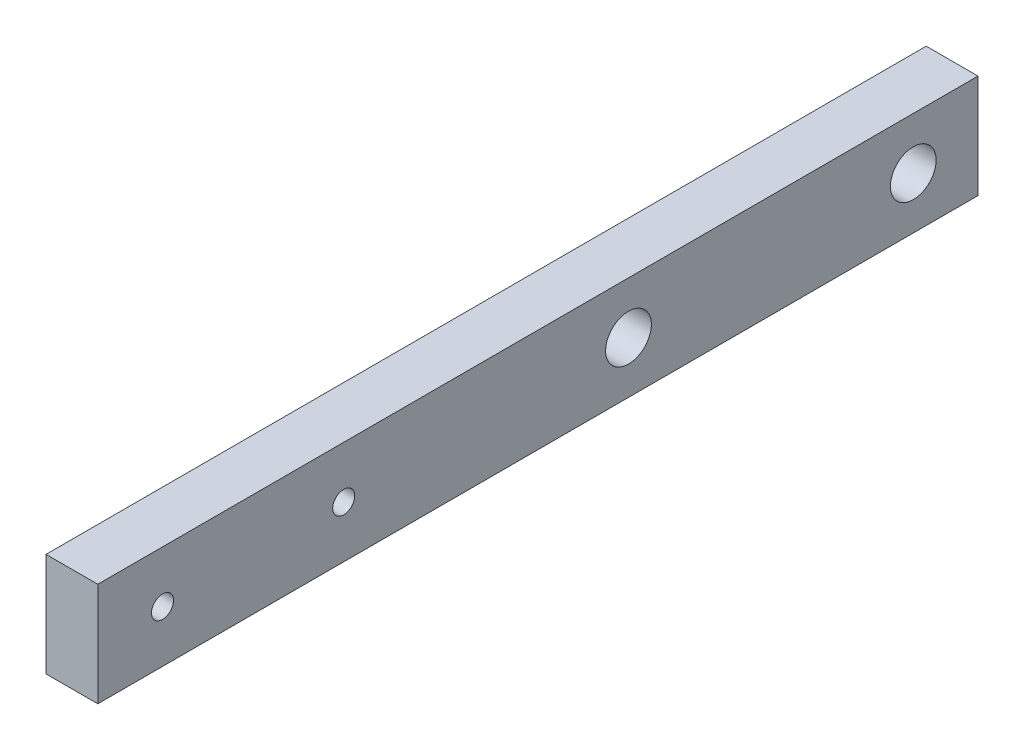
ISO-10303-21;
HEADER;
FILE_DESCRIPTION(('STEP AP214'),'2;1');
FILE_NAME('part.step','',(''),(''),'','','');
FILE_SCHEMA(('AUTOMOTIVE_DESIGN { 1 0 10303 214 1 1 1 1 }'));
ENDSEC;
DATA;
#1=APPLICATION_CONTEXT('core data for automotive mechanical design processes');
#2=APPLICATION_PROTOCOL_DEFINITION('international standard','automotive_design',2000,#1);
#3=PRODUCT_CONTEXT('',#1,'mechanical');
#4=PRODUCT('Part','Part','',(#3));
#5=PRODUCT_RELATED_PRODUCT_CATEGORY('part','',(#4));
#6=PRODUCT_DEFINITION_FORMATION('','',#4);
#7=PRODUCT_DEFINITION_CONTEXT('part definition',#1,'design');
#8=PRODUCT_DEFINITION('design','',#6,#7);
#9=PRODUCT_DEFINITION_SHAPE('','',#8);
#10=(LENGTH_UNIT() NAMED_UNIT(*) SI_UNIT(.MILLI.,.METRE.));
#11=(NAMED_UNIT(*) PLANE_ANGLE_UNIT() SI_UNIT($,.RADIAN.));
#12=(NAMED_UNIT(*) SI_UNIT($,.STERADIAN.) SOLID_ANGLE_UNIT());
#13=UNCERTAINTY_MEASURE_WITH_UNIT(LENGTH_MEASURE(1.E-05),#10,'distance_accuracy_value','');
#14=(GEOMETRIC_REPRESENTATION_CONTEXT(3) GLOBAL_UNCERTAINTY_ASSIGNED_CONTEXT((#13)) GLOBAL_UNIT_ASSIGNED_CONTEXT((#10,
#11,#12)) REPRESENTATION_CONTEXT('',''));
#15=CARTESIAN_POINT('',(0.,0.,0.));
#16=DIRECTION('',(0.,0.,1.));
#17=DIRECTION('',(1.,0.,0.));
#18=AXIS2_PLACEMENT_3D('',#15,#16,#17);
#19=CARTESIAN_POINT('',(0.,0.,107.95));
#20=DIRECTION('',(1.,0.,0.));
#21=DIRECTION('',(0.,0.,-1.));
#22=AXIS2_PLACEMENT_3D('',#19,#20,#21);
#23=PLANE('',#22);
#24=CARTESIAN_POINT('',(0.,6.35,100.0125));
#25=DIRECTION('',(-1.,0.,0.));
#26=DIRECTION('',(0.,0.,1.));
#27=AXIS2_PLACEMENT_3D('',#24,#25,#26);
#28=CIRCLE('',#27,1.35254999999999);
#29=CARTESIAN_POINT('',(0.,6.35,101.36505));
#30=VERTEX_POINT('',#29);
#31=EDGE_CURVE('E147',#30,#30,#28,.T.);
#32=ORIENTED_EDGE('',*,*,#31,.F.);
#33=EDGE_LOOP('',(#32));
#34=FACE_BOUND('',#33,.T.);
#35=CARTESIAN_POINT('',(0.,6.35,77.7875));
#36=DIRECTION('',(-1.,0.,0.));
#37=DIRECTION('',(0.,0.,1.));
#38=AXIS2_PLACEMENT_3D('',#35,#36,#37);
#39=CIRCLE('',#38,1.35254999999999);
#40=CARTESIAN_POINT('',(0.,6.35,79.14005));
#41=VERTEX_POINT('',#40);
#42=EDGE_CURVE('E151',#41,#41,#39,.T.);
#43=ORIENTED_EDGE('',*,*,#42,.F.);
#44=EDGE_LOOP('',(#43));
#45=FACE_BOUND('',#44,.T.);
#46=CARTESIAN_POINT('',(0.,6.35,42.8625));
#47=DIRECTION('',(1.,0.,0.));
#48=DIRECTION('',(0.,0.,-1.));
#49=AXIS2_PLACEMENT_3D('',#46,#47,#48);
#50=CIRCLE('',#49,2.8067);
#51=CARTESIAN_POINT('',(0.,6.35,40.0558));
#52=VERTEX_POINT('',#51);
#53=EDGE_CURVE('E155',#52,#52,#50,.T.);
#54=ORIENTED_EDGE('',*,*,#53,.T.);
#55=EDGE_LOOP('',(#54));
#56=FACE_BOUND('',#55,.T.);
#57=CARTESIAN_POINT('',(0.,6.35,7.93750000000001));
#58=DIRECTION('',(1.,0.,0.));
#59=DIRECTION('',(0.,0.,-1.));
#60=AXIS2_PLACEMENT_3D('',#57,#58,#59);
#61=CIRCLE('',#60,2.8067);
#62=CARTESIAN_POINT('',(0.,6.35,5.13080000000001));
#63=VERTEX_POINT('',#62);
#64=EDGE_CURVE('E107',#63,#63,#61,.T.);
#65=ORIENTED_EDGE('',*,*,#64,.T.);
#66=EDGE_LOOP('',(#65));
#67=FACE_BOUND('',#66,.T.);
#68=DIRECTION('',(0.,-1.,0.));
#69=VECTOR('',#68,1.);
#70=CARTESIAN_POINT('',(0.,0.,0.));
#71=LINE('',#70,#69);
#72=CARTESIAN_POINT('',(0.,12.7,0.));
#73=VERTEX_POINT('',#72);
#74=CARTESIAN_POINT('',(0.,0.,0.));
#75=VERTEX_POINT('',#74);
#76=EDGE_CURVE('E94',#73,#75,#71,.T.);
#77=ORIENTED_EDGE('',*,*,#76,.T.);
#78=DIRECTION('',(0.,0.,-1.));
#79=VECTOR('',#78,1.);
#80=CARTESIAN_POINT('',(0.,0.,107.95));
#81=LINE('',#80,#79);
#82=CARTESIAN_POINT('',(0.,0.,107.95));
#83=VERTEX_POINT('',#82);
#84=EDGE_CURVE('E13',#83,#75,#81,.T.);
#85=ORIENTED_EDGE('',*,*,#84,.F.);
#86=DIRECTION('',(0.,-1.,0.));
#87=VECTOR('',#86,1.);
#88=CARTESIAN_POINT('',(0.,0.,107.95));
#89=LINE('',#88,#87);
#90=CARTESIAN_POINT('',(0.,12.7,107.95));
#91=VERTEX_POINT('',#90);
#92=EDGE_CURVE('E117',#91,#83,#89,.T.);
#93=ORIENTED_EDGE('',*,*,#92,.F.);
#94=DIRECTION('',(0.,0.,-1.));
#95=VECTOR('',#94,1.);
#96=CARTESIAN_POINT('',(0.,12.7,107.95));
#97=LINE('',#96,#95);
#98=EDGE_CURVE('E106',#91,#73,#97,.T.);
#99=ORIENTED_EDGE('',*,*,#98,.T.);
#100=EDGE_LOOP('',(#77,#85,#93,#99));
#101=FACE_BOUND('',#100,.T.);
#102=ADVANCED_FACE('F50',(#34,#45,#56,#67,#101),#23,.F.);
#103=CARTESIAN_POINT('',(0.,0.,107.95));
#104=DIRECTION('',(0.,1.,0.));
#105=DIRECTION('',(0.,0.,1.));
#106=AXIS2_PLACEMENT_3D('',#103,#104,#105);
#107=PLANE('',#106);
#108=DIRECTION('',(1.,0.,0.));
#109=VECTOR('',#108,1.);
#110=CARTESIAN_POINT('',(0.,0.,0.));
#111=LINE('',#110,#109);
#112=CARTESIAN_POINT('',(6.35,0.,0.));
#113=VERTEX_POINT('',#112);
#114=EDGE_CURVE('E90',#75,#113,#111,.T.);
#115=ORIENTED_EDGE('',*,*,#114,.T.);
#116=DIRECTION('',(0.,0.,-1.));
#117=VECTOR('',#116,1.);
#118=CARTESIAN_POINT('',(6.35,0.,107.95));
#119=LINE('',#118,#117);
#120=CARTESIAN_POINT('',(6.35,0.,107.95));
#121=VERTEX_POINT('',#120);
#122=EDGE_CURVE('E57',#121,#113,#119,.T.);
#123=ORIENTED_EDGE('',*,*,#122,.F.);
#124=DIRECTION('',(1.,0.,0.));
#125=VECTOR('',#124,1.);
#126=CARTESIAN_POINT('',(0.,0.,107.95));
#127=LINE('',#126,#125);
#128=EDGE_CURVE('E102',#83,#121,#127,.T.);
#129=ORIENTED_EDGE('',*,*,#128,.F.);
#130=ORIENTED_EDGE('',*,*,#84,.T.);
#131=EDGE_LOOP('',(#115,#123,#129,#130));
#132=FACE_BOUND('',#131,.T.);
#133=ADVANCED_FACE('F101',(#132),#107,.F.);
#134=CARTESIAN_POINT('',(6.35,0.,107.95));
#135=DIRECTION('',(-1.,0.,0.));
#136=DIRECTION('',(0.,0.,1.));
#137=AXIS2_PLACEMENT_3D('',#134,#135,#136);
#138=PLANE('',#137);
#139=CARTESIAN_POINT('',(6.35,6.35,100.0125));
#140=DIRECTION('',(-1.,0.,0.));
#141=DIRECTION('',(0.,0.,1.));
#142=AXIS2_PLACEMENT_3D('',#139,#140,#141);
#143=CIRCLE('',#142,1.35255);
#144=CARTESIAN_POINT('',(6.35,6.35,101.36505));
#145=VERTEX_POINT('',#144);
#146=EDGE_CURVE('E175',#145,#145,#143,.T.);
#147=ORIENTED_EDGE('',*,*,#146,.T.);
#148=EDGE_LOOP('',(#147));
#149=FACE_BOUND('',#148,.T.);
#150=CARTESIAN_POINT('',(6.35,6.35,77.7875));
#151=DIRECTION('',(-1.,0.,0.));
#152=DIRECTION('',(0.,0.,1.));
#153=AXIS2_PLACEMENT_3D('',#150,#151,#152);
#154=CIRCLE('',#153,1.35255);
#155=CARTESIAN_POINT('',(6.35,6.35,79.14005));
#156=VERTEX_POINT('',#155);
#157=EDGE_CURVE('E171',#156,#156,#154,.T.);
#158=ORIENTED_EDGE('',*,*,#157,.T.);
#159=EDGE_LOOP('',(#158));
#160=FACE_BOUND('',#159,.T.);
#161=CARTESIAN_POINT('',(6.35,6.35,42.8625));
#162=DIRECTION('',(1.,0.,0.));
#163=DIRECTION('',(0.,0.,-1.));
#164=AXIS2_PLACEMENT_3D('',#161,#162,#163);
#165=CIRCLE('',#164,2.80669999999999);
#166=CARTESIAN_POINT('',(6.35,6.35,40.0558));
#167=VERTEX_POINT('',#166);
#168=EDGE_CURVE('E165',#167,#167,#165,.T.);
#169=ORIENTED_EDGE('',*,*,#168,.F.);
#170=EDGE_LOOP('',(#169));
#171=FACE_BOUND('',#170,.T.);
#172=CARTESIAN_POINT('',(6.35,6.35,7.93750000000001));
#173=DIRECTION('',(1.,0.,0.));
#174=DIRECTION('',(0.,0.,-1.));
#175=AXIS2_PLACEMENT_3D('',#172,#173,#174);
#176=CIRCLE('',#175,2.80669999999999);
#177=CARTESIAN_POINT('',(6.35,6.35,5.13080000000003));
#178=VERTEX_POINT('',#177);
#179=EDGE_CURVE('E110',#178,#178,#176,.T.);
#180=ORIENTED_EDGE('',*,*,#179,.F.);
#181=EDGE_LOOP('',(#180));
#182=FACE_BOUND('',#181,.T.);
#183=DIRECTION('',(0.,1.,0.));
#184=VECTOR('',#183,1.);
#185=CARTESIAN_POINT('',(6.35,0.,0.));
#186=LINE('',#185,#184);
#187=CARTESIAN_POINT('',(6.35,12.7,0.));
#188=VERTEX_POINT('',#187);
#189=EDGE_CURVE('E95',#113,#188,#186,.T.);
#190=ORIENTED_EDGE('',*,*,#189,.T.);
#191=DIRECTION('',(0.,0.,-1.));
#192=VECTOR('',#191,1.);
#193=CARTESIAN_POINT('',(6.35,12.7,107.95));
#194=LINE('',#193,#192);
#195=CARTESIAN_POINT('',(6.35,12.7,107.95));
#196=VERTEX_POINT('',#195);
#197=EDGE_CURVE('E123',#196,#188,#194,.T.);
#198=ORIENTED_EDGE('',*,*,#197,.F.);
#199=DIRECTION('',(0.,1.,0.));
#200=VECTOR('',#199,1.);
#201=CARTESIAN_POINT('',(6.35,0.,107.95));
#202=LINE('',#201,#200);
#203=EDGE_CURVE('E69',#121,#196,#202,.T.);
#204=ORIENTED_EDGE('',*,*,#203,.F.);
#205=ORIENTED_EDGE('',*,*,#122,.T.);
#206=EDGE_LOOP('',(#190,#198,#204,#205));
#207=FACE_BOUND('',#206,.T.);
#208=ADVANCED_FACE('F126',(#149,#160,#171,#182,#207),#138,.F.);
#209=CARTESIAN_POINT('',(0.,12.7,107.95));
#210=DIRECTION('',(0.,-1.,0.));
#211=DIRECTION('',(0.,0.,-1.));
#212=AXIS2_PLACEMENT_3D('',#209,#210,#211);
#213=PLANE('',#212);
#214=DIRECTION('',(-1.,0.,0.));
#215=VECTOR('',#214,1.);
#216=CARTESIAN_POINT('',(0.,12.7,0.));
#217=LINE('',#216,#215);
#218=EDGE_CURVE('E115',#188,#73,#217,.T.);
#219=ORIENTED_EDGE('',*,*,#218,.T.);
#220=ORIENTED_EDGE('',*,*,#98,.F.);
#221=DIRECTION('',(-1.,0.,0.));
#222=VECTOR('',#221,1.);
#223=CARTESIAN_POINT('',(0.,12.7,107.95));
#224=LINE('',#223,#222);
#225=EDGE_CURVE('E64',#196,#91,#224,.T.);
#226=ORIENTED_EDGE('',*,*,#225,.F.);
#227=ORIENTED_EDGE('',*,*,#197,.T.);
#228=EDGE_LOOP('',(#219,#220,#226,#227));
#229=FACE_BOUND('',#228,.T.);
#230=ADVANCED_FACE('F128',(#229),#213,.F.);
#231=CARTESIAN_POINT('',(0.,12.7,107.95));
#232=DIRECTION('',(0.,0.,-1.));
#233=DIRECTION('',(-1.,0.,0.));
#234=AXIS2_PLACEMENT_3D('',#231,#232,#233);
#235=PLANE('',#234);
#236=ORIENTED_EDGE('',*,*,#92,.T.);
#237=ORIENTED_EDGE('',*,*,#128,.T.);
#238=ORIENTED_EDGE('',*,*,#203,.T.);
#239=ORIENTED_EDGE('',*,*,#225,.T.);
#240=EDGE_LOOP('',(#236,#237,#238,#239));
#241=FACE_BOUND('',#240,.T.);
#242=ADVANCED_FACE('F129',(#241),#235,.F.);
#243=CARTESIAN_POINT('',(0.,12.7,0.));
#244=DIRECTION('',(0.,0.,-1.));
#245=DIRECTION('',(-1.,0.,0.));
#246=AXIS2_PLACEMENT_3D('',#243,#244,#245);
#247=PLANE('',#246);
#248=ORIENTED_EDGE('',*,*,#76,.F.);
#249=ORIENTED_EDGE('',*,*,#218,.F.);
#250=ORIENTED_EDGE('',*,*,#189,.F.);
#251=ORIENTED_EDGE('',*,*,#114,.F.);
#252=EDGE_LOOP('',(#248,#249,#250,#251));
#253=FACE_BOUND('',#252,.T.);
#254=ADVANCED_FACE('F91',(#253),#247,.T.);
#255=CARTESIAN_POINT('',(6.35,6.35,7.93750000000001));
#256=DIRECTION('',(1.,0.,0.));
#257=DIRECTION('',(0.,0.,-1.));
#258=AXIS2_PLACEMENT_3D('',#255,#256,#257);
#259=CYLINDRICAL_SURFACE('',#258,2.80669999999999);
#260=ORIENTED_EDGE('',*,*,#64,.F.);
#261=EDGE_LOOP('',(#260));
#262=FACE_BOUND('',#261,.T.);
#263=ORIENTED_EDGE('',*,*,#179,.T.);
#264=EDGE_LOOP('',(#263));
#265=FACE_BOUND('',#264,.T.);
#266=ADVANCED_FACE('F136',(#262,#265),#259,.F.);
#267=CARTESIAN_POINT('',(6.35,6.35,42.8625));
#268=DIRECTION('',(1.,0.,0.));
#269=DIRECTION('',(0.,0.,-1.));
#270=AXIS2_PLACEMENT_3D('',#267,#268,#269);
#271=CYLINDRICAL_SURFACE('',#270,2.80669999999999);
#272=ORIENTED_EDGE('',*,*,#53,.F.);
#273=EDGE_LOOP('',(#272));
#274=FACE_BOUND('',#273,.T.);
#275=ORIENTED_EDGE('',*,*,#168,.T.);
#276=EDGE_LOOP('',(#275));
#277=FACE_BOUND('',#276,.T.);
#278=ADVANCED_FACE('F160',(#274,#277),#271,.F.);
#279=CARTESIAN_POINT('',(0.,6.35,77.7875));
#280=DIRECTION('',(-1.,0.,0.));
#281=DIRECTION('',(0.,0.,1.));
#282=AXIS2_PLACEMENT_3D('',#279,#280,#281);
#283=CYLINDRICAL_SURFACE('',#282,1.35254999999999);
#284=ORIENTED_EDGE('',*,*,#157,.F.);
#285=EDGE_LOOP('',(#284));
#286=FACE_BOUND('',#285,.T.);
#287=ORIENTED_EDGE('',*,*,#42,.T.);
#288=EDGE_LOOP('',(#287));
#289=FACE_BOUND('',#288,.T.);
#290=ADVANCED_FACE('F184',(#286,#289),#283,.F.);
#291=CARTESIAN_POINT('',(0.,6.35,100.0125));
#292=DIRECTION('',(-1.,0.,0.));
#293=DIRECTION('',(0.,0.,1.));
#294=AXIS2_PLACEMENT_3D('',#291,#292,#293);
#295=CYLINDRICAL_SURFACE('',#294,1.35254999999999);
#296=ORIENTED_EDGE('',*,*,#146,.F.);
#297=EDGE_LOOP('',(#296));
#298=FACE_BOUND('',#297,.T.);
#299=ORIENTED_EDGE('',*,*,#31,.T.);
#300=EDGE_LOOP('',(#299));
#301=FACE_BOUND('',#300,.T.);
#302=ADVANCED_FACE('F181',(#298,#301),#295,.F.);
#303=CLOSED_SHELL('',(#102,#133,#208,#230,#242,#254,#266,#278,#290,#302));
#304=MANIFOLD_SOLID_BREP('B2',#303);
#305=ADVANCED_BREP_SHAPE_REPRESENTATION('',(#18,#304),#14);
#306=SHAPE_DEFINITION_REPRESENTATION(#9,#305);
ENDSEC;
END-ISO-10303-21;
